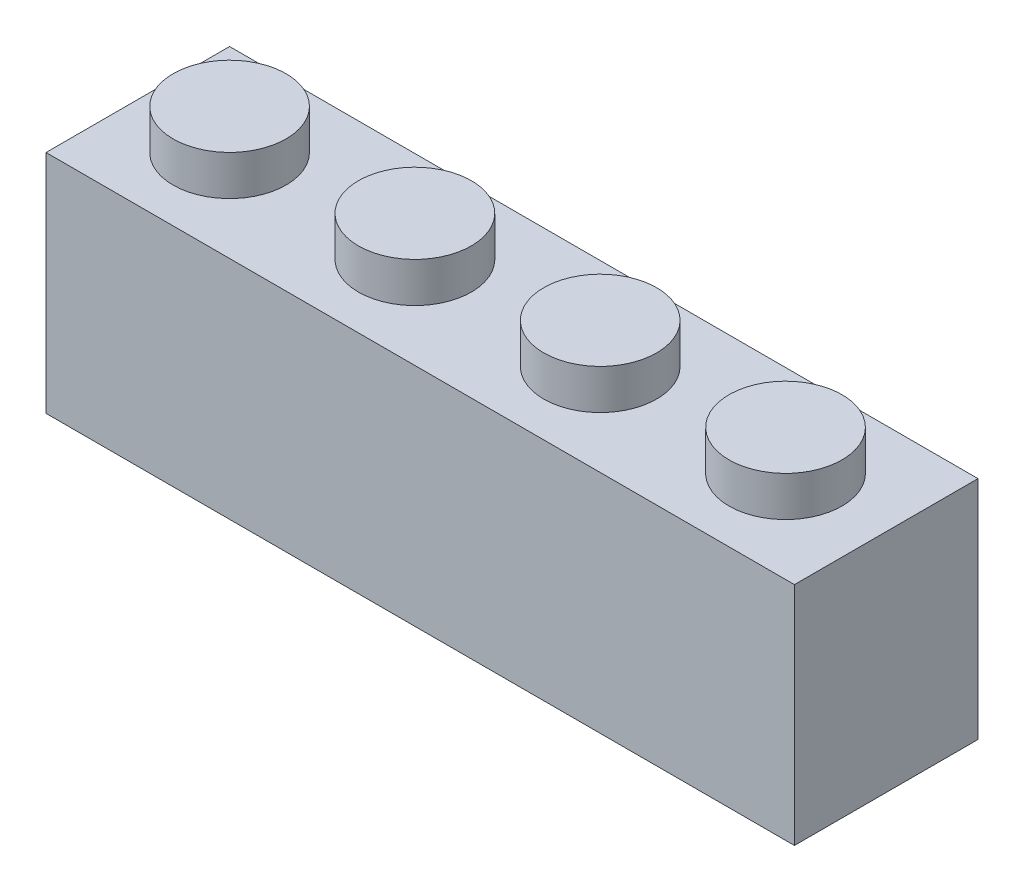
ISO-10303-21;
HEADER;
FILE_DESCRIPTION(('STEP AP214'),'2;1');
FILE_NAME('part.step','',(''),(''),'','','');
FILE_SCHEMA(('AUTOMOTIVE_DESIGN { 1 0 10303 214 1 1 1 1 }'));
ENDSEC;
DATA;
#1=APPLICATION_CONTEXT('core data for automotive mechanical design processes');
#2=APPLICATION_PROTOCOL_DEFINITION('international standard','automotive_design',2000,#1);
#3=PRODUCT_CONTEXT('',#1,'mechanical');
#4=PRODUCT('Part','Part','',(#3));
#5=PRODUCT_RELATED_PRODUCT_CATEGORY('part','',(#4));
#6=PRODUCT_DEFINITION_FORMATION('','',#4);
#7=PRODUCT_DEFINITION_CONTEXT('part definition',#1,'design');
#8=PRODUCT_DEFINITION('design','',#6,#7);
#9=PRODUCT_DEFINITION_SHAPE('','',#8);
#10=(LENGTH_UNIT() NAMED_UNIT(*) SI_UNIT(.MILLI.,.METRE.));
#11=(NAMED_UNIT(*) PLANE_ANGLE_UNIT() SI_UNIT($,.RADIAN.));
#12=(NAMED_UNIT(*) SI_UNIT($,.STERADIAN.) SOLID_ANGLE_UNIT());
#13=UNCERTAINTY_MEASURE_WITH_UNIT(LENGTH_MEASURE(1.E-05),#10,'distance_accuracy_value','');
#14=(GEOMETRIC_REPRESENTATION_CONTEXT(3) GLOBAL_UNCERTAINTY_ASSIGNED_CONTEXT((#13)) GLOBAL_UNIT_ASSIGNED_CONTEXT((#10,
#11,#12)) REPRESENTATION_CONTEXT('',''));
#15=CARTESIAN_POINT('',(0.,0.,0.));
#16=DIRECTION('',(0.,0.,1.));
#17=DIRECTION('',(1.,0.,0.));
#18=AXIS2_PLACEMENT_3D('',#15,#16,#17);
#19=CARTESIAN_POINT('',(-15.9,9.6,3.9));
#20=DIRECTION('',(1.,0.,0.));
#21=DIRECTION('',(0.,0.,-1.));
#22=AXIS2_PLACEMENT_3D('',#19,#20,#21);
#23=PLANE('',#22);
#24=DIRECTION('',(0.,0.,1.));
#25=VECTOR('',#24,1.);
#26=CARTESIAN_POINT('',(-15.9,0.,3.9));
#27=LINE('',#26,#25);
#28=CARTESIAN_POINT('',(-15.9,0.,-3.9));
#29=VERTEX_POINT('',#28);
#30=CARTESIAN_POINT('',(-15.9,0.,3.9));
#31=VERTEX_POINT('',#30);
#32=EDGE_CURVE('E96',#29,#31,#27,.T.);
#33=ORIENTED_EDGE('',*,*,#32,.T.);
#34=DIRECTION('',(0.,-1.,0.));
#35=VECTOR('',#34,1.);
#36=CARTESIAN_POINT('',(-15.9,9.6,3.9));
#37=LINE('',#36,#35);
#38=CARTESIAN_POINT('',(-15.9,9.6,3.9));
#39=VERTEX_POINT('',#38);
#40=EDGE_CURVE('E11',#39,#31,#37,.T.);
#41=ORIENTED_EDGE('',*,*,#40,.F.);
#42=DIRECTION('',(0.,0.,1.));
#43=VECTOR('',#42,1.);
#44=CARTESIAN_POINT('',(-15.9,9.6,3.9));
#45=LINE('',#44,#43);
#46=CARTESIAN_POINT('',(-15.9,9.6,-3.9));
#47=VERTEX_POINT('',#46);
#48=EDGE_CURVE('E84',#47,#39,#45,.T.);
#49=ORIENTED_EDGE('',*,*,#48,.F.);
#50=DIRECTION('',(0.,-1.,0.));
#51=VECTOR('',#50,1.);
#52=CARTESIAN_POINT('',(-15.9,9.6,-3.9));
#53=LINE('',#52,#51);
#54=EDGE_CURVE('E92',#47,#29,#53,.T.);
#55=ORIENTED_EDGE('',*,*,#54,.T.);
#56=EDGE_LOOP('',(#33,#41,#49,#55));
#57=FACE_BOUND('',#56,.T.);
#58=ADVANCED_FACE('F33',(#57),#23,.F.);
#59=CARTESIAN_POINT('',(15.9,9.6,3.9));
#60=DIRECTION('',(0.,0.,-1.));
#61=DIRECTION('',(-1.,0.,0.));
#62=AXIS2_PLACEMENT_3D('',#59,#60,#61);
#63=PLANE('',#62);
#64=DIRECTION('',(1.,0.,0.));
#65=VECTOR('',#64,1.);
#66=CARTESIAN_POINT('',(15.9,0.,3.9));
#67=LINE('',#66,#65);
#68=CARTESIAN_POINT('',(15.9,0.,3.9));
#69=VERTEX_POINT('',#68);
#70=EDGE_CURVE('E88',#31,#69,#67,.T.);
#71=ORIENTED_EDGE('',*,*,#70,.T.);
#72=DIRECTION('',(0.,-1.,0.));
#73=VECTOR('',#72,1.);
#74=CARTESIAN_POINT('',(15.9,9.6,3.9));
#75=LINE('',#74,#73);
#76=CARTESIAN_POINT('',(15.9,9.6,3.9));
#77=VERTEX_POINT('',#76);
#78=EDGE_CURVE('E41',#77,#69,#75,.T.);
#79=ORIENTED_EDGE('',*,*,#78,.F.);
#80=DIRECTION('',(1.,0.,0.));
#81=VECTOR('',#80,1.);
#82=CARTESIAN_POINT('',(15.9,9.6,3.9));
#83=LINE('',#82,#81);
#84=EDGE_CURVE('E79',#39,#77,#83,.T.);
#85=ORIENTED_EDGE('',*,*,#84,.F.);
#86=ORIENTED_EDGE('',*,*,#40,.T.);
#87=EDGE_LOOP('',(#71,#79,#85,#86));
#88=FACE_BOUND('',#87,.T.);
#89=ADVANCED_FACE('F87',(#88),#63,.F.);
#90=CARTESIAN_POINT('',(15.9,9.6,3.9));
#91=DIRECTION('',(-1.,0.,0.));
#92=DIRECTION('',(0.,0.,1.));
#93=AXIS2_PLACEMENT_3D('',#90,#91,#92);
#94=PLANE('',#93);
#95=DIRECTION('',(0.,0.,-1.));
#96=VECTOR('',#95,1.);
#97=CARTESIAN_POINT('',(15.9,0.,3.9));
#98=LINE('',#97,#96);
#99=CARTESIAN_POINT('',(15.9,0.,-3.9));
#100=VERTEX_POINT('',#99);
#101=EDGE_CURVE('E66',#69,#100,#98,.T.);
#102=ORIENTED_EDGE('',*,*,#101,.T.);
#103=DIRECTION('',(0.,-1.,0.));
#104=VECTOR('',#103,1.);
#105=CARTESIAN_POINT('',(15.9,9.6,-3.9));
#106=LINE('',#105,#104);
#107=CARTESIAN_POINT('',(15.9,9.6,-3.9));
#108=VERTEX_POINT('',#107);
#109=EDGE_CURVE('E89',#108,#100,#106,.T.);
#110=ORIENTED_EDGE('',*,*,#109,.F.);
#111=DIRECTION('',(0.,0.,-1.));
#112=VECTOR('',#111,1.);
#113=CARTESIAN_POINT('',(15.9,9.6,3.9));
#114=LINE('',#113,#112);
#115=EDGE_CURVE('E82',#77,#108,#114,.T.);
#116=ORIENTED_EDGE('',*,*,#115,.F.);
#117=ORIENTED_EDGE('',*,*,#78,.T.);
#118=EDGE_LOOP('',(#102,#110,#116,#117));
#119=FACE_BOUND('',#118,.T.);
#120=ADVANCED_FACE('F90',(#119),#94,.F.);
#121=CARTESIAN_POINT('',(15.9,9.6,-3.9));
#122=DIRECTION('',(0.,0.,1.));
#123=DIRECTION('',(1.,0.,0.));
#124=AXIS2_PLACEMENT_3D('',#121,#122,#123);
#125=PLANE('',#124);
#126=DIRECTION('',(-1.,0.,0.));
#127=VECTOR('',#126,1.);
#128=CARTESIAN_POINT('',(15.9,0.,-3.9));
#129=LINE('',#128,#127);
#130=EDGE_CURVE('E72',#100,#29,#129,.T.);
#131=ORIENTED_EDGE('',*,*,#130,.T.);
#132=ORIENTED_EDGE('',*,*,#54,.F.);
#133=DIRECTION('',(-1.,0.,0.));
#134=VECTOR('',#133,1.);
#135=CARTESIAN_POINT('',(15.9,9.6,-3.9));
#136=LINE('',#135,#134);
#137=EDGE_CURVE('E49',#108,#47,#136,.T.);
#138=ORIENTED_EDGE('',*,*,#137,.F.);
#139=ORIENTED_EDGE('',*,*,#109,.T.);
#140=EDGE_LOOP('',(#131,#132,#138,#139));
#141=FACE_BOUND('',#140,.T.);
#142=ADVANCED_FACE('F104',(#141),#125,.F.);
#143=CARTESIAN_POINT('',(0.,9.6,0.));
#144=DIRECTION('',(0.,1.,0.));
#145=DIRECTION('',(0.,0.,1.));
#146=AXIS2_PLACEMENT_3D('',#143,#144,#145);
#147=PLANE('',#146);
#148=CARTESIAN_POINT('',(11.622,9.6,0.));
#149=DIRECTION('',(0.,1.,0.));
#150=DIRECTION('',(0.,0.,1.));
#151=AXIS2_PLACEMENT_3D('',#148,#149,#150);
#152=CIRCLE('',#151,2.4);
#153=CARTESIAN_POINT('',(11.622,9.6,2.4));
#154=VERTEX_POINT('',#153);
#155=EDGE_CURVE('E128',#154,#154,#152,.T.);
#156=ORIENTED_EDGE('',*,*,#155,.F.);
#157=EDGE_LOOP('',(#156));
#158=FACE_BOUND('',#157,.T.);
#159=CARTESIAN_POINT('',(3.748,9.6,0.));
#160=DIRECTION('',(0.,1.,0.));
#161=DIRECTION('',(0.,0.,1.));
#162=AXIS2_PLACEMENT_3D('',#159,#160,#161);
#163=CIRCLE('',#162,2.4);
#164=CARTESIAN_POINT('',(3.748,9.6,2.4));
#165=VERTEX_POINT('',#164);
#166=EDGE_CURVE('E122',#165,#165,#163,.T.);
#167=ORIENTED_EDGE('',*,*,#166,.F.);
#168=EDGE_LOOP('',(#167));
#169=FACE_BOUND('',#168,.T.);
#170=CARTESIAN_POINT('',(-4.126,9.6,0.));
#171=DIRECTION('',(0.,1.,0.));
#172=DIRECTION('',(0.,0.,1.));
#173=AXIS2_PLACEMENT_3D('',#170,#171,#172);
#174=CIRCLE('',#173,2.4);
#175=CARTESIAN_POINT('',(-4.126,9.6,2.4));
#176=VERTEX_POINT('',#175);
#177=EDGE_CURVE('E116',#176,#176,#174,.T.);
#178=ORIENTED_EDGE('',*,*,#177,.F.);
#179=EDGE_LOOP('',(#178));
#180=FACE_BOUND('',#179,.T.);
#181=CARTESIAN_POINT('',(-12.,9.6,0.));
#182=DIRECTION('',(0.,1.,0.));
#183=DIRECTION('',(0.,0.,1.));
#184=AXIS2_PLACEMENT_3D('',#181,#182,#183);
#185=CIRCLE('',#184,2.4);
#186=CARTESIAN_POINT('',(-12.,9.6,2.4));
#187=VERTEX_POINT('',#186);
#188=EDGE_CURVE('E110',#187,#187,#185,.T.);
#189=ORIENTED_EDGE('',*,*,#188,.F.);
#190=EDGE_LOOP('',(#189));
#191=FACE_BOUND('',#190,.T.);
#192=ORIENTED_EDGE('',*,*,#48,.T.);
#193=ORIENTED_EDGE('',*,*,#84,.T.);
#194=ORIENTED_EDGE('',*,*,#115,.T.);
#195=ORIENTED_EDGE('',*,*,#137,.T.);
#196=EDGE_LOOP('',(#192,#193,#194,#195));
#197=FACE_BOUND('',#196,.T.);
#198=ADVANCED_FACE('F80',(#158,#169,#180,#191,#197),#147,.T.);
#199=CARTESIAN_POINT('',(0.,0.,0.));
#200=DIRECTION('',(0.,1.,0.));
#201=DIRECTION('',(0.,0.,1.));
#202=AXIS2_PLACEMENT_3D('',#199,#200,#201);
#203=PLANE('',#202);
#204=CARTESIAN_POINT('',(-12.,0.,0.));
#205=DIRECTION('',(0.,-1.,0.));
#206=DIRECTION('',(0.,0.,-1.));
#207=AXIS2_PLACEMENT_3D('',#204,#205,#206);
#208=CIRCLE('',#207,2.5);
#209=CARTESIAN_POINT('',(-12.,0.,-2.5));
#210=VERTEX_POINT('',#209);
#211=EDGE_CURVE('E152',#210,#210,#208,.T.);
#212=ORIENTED_EDGE('',*,*,#211,.F.);
#213=EDGE_LOOP('',(#212));
#214=FACE_BOUND('',#213,.T.);
#215=CARTESIAN_POINT('',(-4.126,0.,0.));
#216=DIRECTION('',(0.,-1.,0.));
#217=DIRECTION('',(0.,0.,-1.));
#218=AXIS2_PLACEMENT_3D('',#215,#216,#217);
#219=CIRCLE('',#218,2.5);
#220=CARTESIAN_POINT('',(-4.126,0.,-2.5));
#221=VERTEX_POINT('',#220);
#222=EDGE_CURVE('E146',#221,#221,#219,.T.);
#223=ORIENTED_EDGE('',*,*,#222,.F.);
#224=EDGE_LOOP('',(#223));
#225=FACE_BOUND('',#224,.T.);
#226=CARTESIAN_POINT('',(3.748,0.,0.));
#227=DIRECTION('',(0.,-1.,0.));
#228=DIRECTION('',(0.,0.,-1.));
#229=AXIS2_PLACEMENT_3D('',#226,#227,#228);
#230=CIRCLE('',#229,2.5);
#231=CARTESIAN_POINT('',(3.748,0.,-2.5));
#232=VERTEX_POINT('',#231);
#233=EDGE_CURVE('E140',#232,#232,#230,.T.);
#234=ORIENTED_EDGE('',*,*,#233,.F.);
#235=EDGE_LOOP('',(#234));
#236=FACE_BOUND('',#235,.T.);
#237=CARTESIAN_POINT('',(11.622,0.,0.));
#238=DIRECTION('',(0.,-1.,0.));
#239=DIRECTION('',(0.,0.,-1.));
#240=AXIS2_PLACEMENT_3D('',#237,#238,#239);
#241=CIRCLE('',#240,2.5);
#242=CARTESIAN_POINT('',(11.622,0.,-2.5));
#243=VERTEX_POINT('',#242);
#244=EDGE_CURVE('E134',#243,#243,#241,.T.);
#245=ORIENTED_EDGE('',*,*,#244,.F.);
#246=EDGE_LOOP('',(#245));
#247=FACE_BOUND('',#246,.T.);
#248=ORIENTED_EDGE('',*,*,#32,.F.);
#249=ORIENTED_EDGE('',*,*,#130,.F.);
#250=ORIENTED_EDGE('',*,*,#101,.F.);
#251=ORIENTED_EDGE('',*,*,#70,.F.);
#252=EDGE_LOOP('',(#248,#249,#250,#251));
#253=FACE_BOUND('',#252,.T.);
#254=ADVANCED_FACE('F107',(#214,#225,#236,#247,#253),#203,.F.);
#255=CARTESIAN_POINT('',(-12.,11.3,0.));
#256=DIRECTION('',(0.,-1.,0.));
#257=DIRECTION('',(0.,0.,-1.));
#258=AXIS2_PLACEMENT_3D('',#255,#256,#257);
#259=CYLINDRICAL_SURFACE('',#258,2.4);
#260=CARTESIAN_POINT('',(-12.,11.3,0.));
#261=DIRECTION('',(0.,1.,0.));
#262=DIRECTION('',(0.,0.,1.));
#263=AXIS2_PLACEMENT_3D('',#260,#261,#262);
#264=CIRCLE('',#263,2.4);
#265=CARTESIAN_POINT('',(-12.,11.3,2.4));
#266=VERTEX_POINT('',#265);
#267=EDGE_CURVE('E99',#266,#266,#264,.T.);
#268=ORIENTED_EDGE('',*,*,#267,.F.);
#269=EDGE_LOOP('',(#268));
#270=FACE_BOUND('',#269,.T.);
#271=ORIENTED_EDGE('',*,*,#188,.T.);
#272=EDGE_LOOP('',(#271));
#273=FACE_BOUND('',#272,.T.);
#274=ADVANCED_FACE('F169',(#270,#273),#259,.T.);
#275=CARTESIAN_POINT('',(-12.,11.3,0.));
#276=DIRECTION('',(0.,1.,0.));
#277=DIRECTION('',(0.,0.,1.));
#278=AXIS2_PLACEMENT_3D('',#275,#276,#277);
#279=PLANE('',#278);
#280=ORIENTED_EDGE('',*,*,#267,.T.);
#281=EDGE_LOOP('',(#280));
#282=FACE_BOUND('',#281,.T.);
#283=ADVANCED_FACE('F210',(#282),#279,.T.);
#284=CARTESIAN_POINT('',(-4.126,11.3,0.));
#285=DIRECTION('',(0.,-1.,0.));
#286=DIRECTION('',(0.,0.,-1.));
#287=AXIS2_PLACEMENT_3D('',#284,#285,#286);
#288=CYLINDRICAL_SURFACE('',#287,2.4);
#289=CARTESIAN_POINT('',(-4.126,11.3,0.));
#290=DIRECTION('',(0.,1.,0.));
#291=DIRECTION('',(0.,0.,1.));
#292=AXIS2_PLACEMENT_3D('',#289,#290,#291);
#293=CIRCLE('',#292,2.4);
#294=CARTESIAN_POINT('',(-4.126,11.3,2.4));
#295=VERTEX_POINT('',#294);
#296=EDGE_CURVE('E113',#295,#295,#293,.T.);
#297=ORIENTED_EDGE('',*,*,#296,.F.);
#298=EDGE_LOOP('',(#297));
#299=FACE_BOUND('',#298,.T.);
#300=ORIENTED_EDGE('',*,*,#177,.T.);
#301=EDGE_LOOP('',(#300));
#302=FACE_BOUND('',#301,.T.);
#303=ADVANCED_FACE('F214',(#299,#302),#288,.T.);
#304=CARTESIAN_POINT('',(-4.126,11.3,0.));
#305=DIRECTION('',(0.,1.,0.));
#306=DIRECTION('',(0.,0.,1.));
#307=AXIS2_PLACEMENT_3D('',#304,#305,#306);
#308=PLANE('',#307);
#309=ORIENTED_EDGE('',*,*,#296,.T.);
#310=EDGE_LOOP('',(#309));
#311=FACE_BOUND('',#310,.T.);
#312=ADVANCED_FACE('F218',(#311),#308,.T.);
#313=CARTESIAN_POINT('',(3.748,11.3,0.));
#314=DIRECTION('',(0.,-1.,0.));
#315=DIRECTION('',(0.,0.,-1.));
#316=AXIS2_PLACEMENT_3D('',#313,#314,#315);
#317=CYLINDRICAL_SURFACE('',#316,2.4);
#318=CARTESIAN_POINT('',(3.748,11.3,0.));
#319=DIRECTION('',(0.,1.,0.));
#320=DIRECTION('',(0.,0.,1.));
#321=AXIS2_PLACEMENT_3D('',#318,#319,#320);
#322=CIRCLE('',#321,2.4);
#323=CARTESIAN_POINT('',(3.748,11.3,2.4));
#324=VERTEX_POINT('',#323);
#325=EDGE_CURVE('E119',#324,#324,#322,.T.);
#326=ORIENTED_EDGE('',*,*,#325,.F.);
#327=EDGE_LOOP('',(#326));
#328=FACE_BOUND('',#327,.T.);
#329=ORIENTED_EDGE('',*,*,#166,.T.);
#330=EDGE_LOOP('',(#329));
#331=FACE_BOUND('',#330,.T.);
#332=ADVANCED_FACE('F222',(#328,#331),#317,.T.);
#333=CARTESIAN_POINT('',(3.748,11.3,0.));
#334=DIRECTION('',(0.,1.,0.));
#335=DIRECTION('',(0.,0.,1.));
#336=AXIS2_PLACEMENT_3D('',#333,#334,#335);
#337=PLANE('',#336);
#338=ORIENTED_EDGE('',*,*,#325,.T.);
#339=EDGE_LOOP('',(#338));
#340=FACE_BOUND('',#339,.T.);
#341=ADVANCED_FACE('F226',(#340),#337,.T.);
#342=CARTESIAN_POINT('',(11.622,11.3,0.));
#343=DIRECTION('',(0.,-1.,0.));
#344=DIRECTION('',(0.,0.,-1.));
#345=AXIS2_PLACEMENT_3D('',#342,#343,#344);
#346=CYLINDRICAL_SURFACE('',#345,2.4);
#347=CARTESIAN_POINT('',(11.622,11.3,0.));
#348=DIRECTION('',(0.,1.,0.));
#349=DIRECTION('',(0.,0.,1.));
#350=AXIS2_PLACEMENT_3D('',#347,#348,#349);
#351=CIRCLE('',#350,2.4);
#352=CARTESIAN_POINT('',(11.622,11.3,2.4));
#353=VERTEX_POINT('',#352);
#354=EDGE_CURVE('E125',#353,#353,#351,.T.);
#355=ORIENTED_EDGE('',*,*,#354,.F.);
#356=EDGE_LOOP('',(#355));
#357=FACE_BOUND('',#356,.T.);
#358=ORIENTED_EDGE('',*,*,#155,.T.);
#359=EDGE_LOOP('',(#358));
#360=FACE_BOUND('',#359,.T.);
#361=ADVANCED_FACE('F190',(#357,#360),#346,.T.);
#362=CARTESIAN_POINT('',(11.622,11.3,0.));
#363=DIRECTION('',(0.,1.,0.));
#364=DIRECTION('',(0.,0.,1.));
#365=AXIS2_PLACEMENT_3D('',#362,#363,#364);
#366=PLANE('',#365);
#367=ORIENTED_EDGE('',*,*,#354,.T.);
#368=EDGE_LOOP('',(#367));
#369=FACE_BOUND('',#368,.T.);
#370=ADVANCED_FACE('F180',(#369),#366,.T.);
#371=CARTESIAN_POINT('',(11.622,1.8,0.));
#372=DIRECTION('',(0.,-1.,0.));
#373=DIRECTION('',(0.,0.,-1.));
#374=AXIS2_PLACEMENT_3D('',#371,#372,#373);
#375=CYLINDRICAL_SURFACE('',#374,2.5);
#376=CARTESIAN_POINT('',(11.622,1.8,0.));
#377=DIRECTION('',(0.,-1.,0.));
#378=DIRECTION('',(0.,0.,-1.));
#379=AXIS2_PLACEMENT_3D('',#376,#377,#378);
#380=CIRCLE('',#379,2.5);
#381=CARTESIAN_POINT('',(11.622,1.8,-2.5));
#382=VERTEX_POINT('',#381);
#383=EDGE_CURVE('E137',#382,#382,#380,.T.);
#384=ORIENTED_EDGE('',*,*,#383,.F.);
#385=EDGE_LOOP('',(#384));
#386=FACE_BOUND('',#385,.T.);
#387=ORIENTED_EDGE('',*,*,#244,.T.);
#388=EDGE_LOOP('',(#387));
#389=FACE_BOUND('',#388,.T.);
#390=ADVANCED_FACE('F177',(#386,#389),#375,.F.);
#391=CARTESIAN_POINT('',(11.622,1.8,0.));
#392=DIRECTION('',(0.,-1.,0.));
#393=DIRECTION('',(0.,0.,-1.));
#394=AXIS2_PLACEMENT_3D('',#391,#392,#393);
#395=PLANE('',#394);
#396=ORIENTED_EDGE('',*,*,#383,.T.);
#397=EDGE_LOOP('',(#396));
#398=FACE_BOUND('',#397,.T.);
#399=ADVANCED_FACE('F179',(#398),#395,.T.);
#400=CARTESIAN_POINT('',(3.748,1.8,0.));
#401=DIRECTION('',(0.,-1.,0.));
#402=DIRECTION('',(0.,0.,-1.));
#403=AXIS2_PLACEMENT_3D('',#400,#401,#402);
#404=CYLINDRICAL_SURFACE('',#403,2.5);
#405=CARTESIAN_POINT('',(3.748,1.8,0.));
#406=DIRECTION('',(0.,-1.,0.));
#407=DIRECTION('',(0.,0.,-1.));
#408=AXIS2_PLACEMENT_3D('',#405,#406,#407);
#409=CIRCLE('',#408,2.5);
#410=CARTESIAN_POINT('',(3.748,1.8,-2.5));
#411=VERTEX_POINT('',#410);
#412=EDGE_CURVE('E143',#411,#411,#409,.T.);
#413=ORIENTED_EDGE('',*,*,#412,.F.);
#414=EDGE_LOOP('',(#413));
#415=FACE_BOUND('',#414,.T.);
#416=ORIENTED_EDGE('',*,*,#233,.T.);
#417=EDGE_LOOP('',(#416));
#418=FACE_BOUND('',#417,.T.);
#419=ADVANCED_FACE('F187',(#415,#418),#404,.F.);
#420=CARTESIAN_POINT('',(3.748,1.8,0.));
#421=DIRECTION('',(0.,-1.,0.));
#422=DIRECTION('',(0.,0.,-1.));
#423=AXIS2_PLACEMENT_3D('',#420,#421,#422);
#424=PLANE('',#423);
#425=ORIENTED_EDGE('',*,*,#412,.T.);
#426=EDGE_LOOP('',(#425));
#427=FACE_BOUND('',#426,.T.);
#428=ADVANCED_FACE('F280',(#427),#424,.T.);
#429=CARTESIAN_POINT('',(-4.126,1.8,0.));
#430=DIRECTION('',(0.,-1.,0.));
#431=DIRECTION('',(0.,0.,-1.));
#432=AXIS2_PLACEMENT_3D('',#429,#430,#431);
#433=CYLINDRICAL_SURFACE('',#432,2.5);
#434=CARTESIAN_POINT('',(-4.126,1.8,0.));
#435=DIRECTION('',(0.,-1.,0.));
#436=DIRECTION('',(0.,0.,-1.));
#437=AXIS2_PLACEMENT_3D('',#434,#435,#436);
#438=CIRCLE('',#437,2.5);
#439=CARTESIAN_POINT('',(-4.126,1.8,-2.5));
#440=VERTEX_POINT('',#439);
#441=EDGE_CURVE('E149',#440,#440,#438,.T.);
#442=ORIENTED_EDGE('',*,*,#441,.F.);
#443=EDGE_LOOP('',(#442));
#444=FACE_BOUND('',#443,.T.);
#445=ORIENTED_EDGE('',*,*,#222,.T.);
#446=EDGE_LOOP('',(#445));
#447=FACE_BOUND('',#446,.T.);
#448=ADVANCED_FACE('F290',(#444,#447),#433,.F.);
#449=CARTESIAN_POINT('',(-4.126,1.8,0.));
#450=DIRECTION('',(0.,-1.,0.));
#451=DIRECTION('',(0.,0.,-1.));
#452=AXIS2_PLACEMENT_3D('',#449,#450,#451);
#453=PLANE('',#452);
#454=ORIENTED_EDGE('',*,*,#441,.T.);
#455=EDGE_LOOP('',(#454));
#456=FACE_BOUND('',#455,.T.);
#457=ADVANCED_FACE('F163',(#456),#453,.T.);
#458=CARTESIAN_POINT('',(-12.,1.8,0.));
#459=DIRECTION('',(0.,-1.,0.));
#460=DIRECTION('',(0.,0.,-1.));
#461=AXIS2_PLACEMENT_3D('',#458,#459,#460);
#462=CYLINDRICAL_SURFACE('',#461,2.5);
#463=CARTESIAN_POINT('',(-12.,1.8,0.));
#464=DIRECTION('',(0.,-1.,0.));
#465=DIRECTION('',(0.,0.,-1.));
#466=AXIS2_PLACEMENT_3D('',#463,#464,#465);
#467=CIRCLE('',#466,2.5);
#468=CARTESIAN_POINT('',(-12.,1.8,-2.5));
#469=VERTEX_POINT('',#468);
#470=EDGE_CURVE('E131',#469,#469,#467,.T.);
#471=ORIENTED_EDGE('',*,*,#470,.F.);
#472=EDGE_LOOP('',(#471));
#473=FACE_BOUND('',#472,.T.);
#474=ORIENTED_EDGE('',*,*,#211,.T.);
#475=EDGE_LOOP('',(#474));
#476=FACE_BOUND('',#475,.T.);
#477=ADVANCED_FACE('F160',(#473,#476),#462,.F.);
#478=CARTESIAN_POINT('',(-12.,1.8,0.));
#479=DIRECTION('',(0.,-1.,0.));
#480=DIRECTION('',(0.,0.,-1.));
#481=AXIS2_PLACEMENT_3D('',#478,#479,#480);
#482=PLANE('',#481);
#483=ORIENTED_EDGE('',*,*,#470,.T.);
#484=EDGE_LOOP('',(#483));
#485=FACE_BOUND('',#484,.T.);
#486=ADVANCED_FACE('F158',(#485),#482,.T.);
#487=CLOSED_SHELL('',(#58,#89,#120,#142,#198,#254,#274,#283,#303,#312,#332,#341,#361,#370,#390,
#399,#419,#428,#448,#457,#477,#486));
#488=MANIFOLD_SOLID_BREP('B2',#487);
#489=ADVANCED_BREP_SHAPE_REPRESENTATION('',(#18,#488),#14);
#490=SHAPE_DEFINITION_REPRESENTATION(#9,#489);
ENDSEC;
END-ISO-10303-21;
